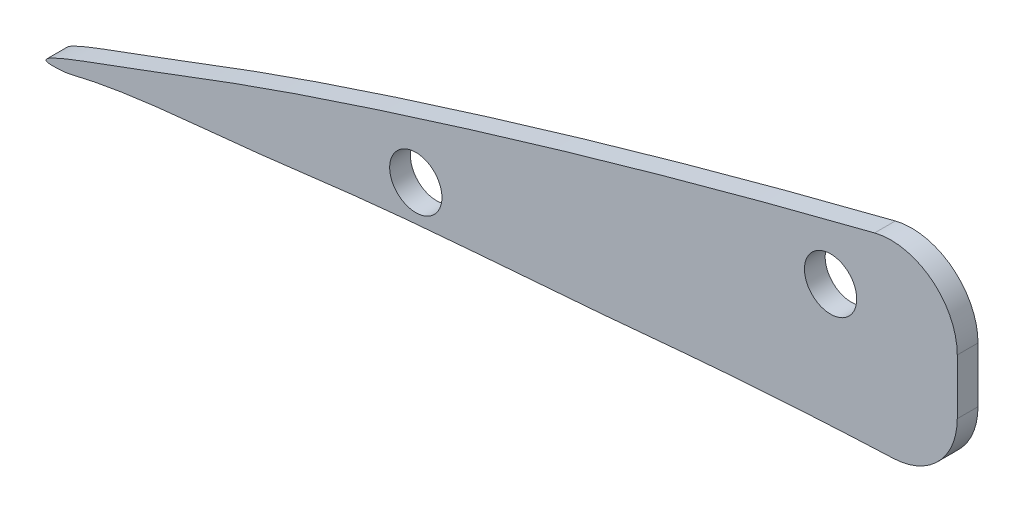
ISO-10303-21;
HEADER;
FILE_DESCRIPTION(('STEP AP214'),'2;1');
FILE_NAME('part.step','',(''),(''),'','','');
FILE_SCHEMA(('AUTOMOTIVE_DESIGN { 1 0 10303 214 1 1 1 1 }'));
ENDSEC;
DATA;
#1=APPLICATION_CONTEXT('core data for automotive mechanical design processes');
#2=APPLICATION_PROTOCOL_DEFINITION('international standard','automotive_design',2000,#1);
#3=PRODUCT_CONTEXT('',#1,'mechanical');
#4=PRODUCT('Part','Part','',(#3));
#5=PRODUCT_RELATED_PRODUCT_CATEGORY('part','',(#4));
#6=PRODUCT_DEFINITION_FORMATION('','',#4);
#7=PRODUCT_DEFINITION_CONTEXT('part definition',#1,'design');
#8=PRODUCT_DEFINITION('design','',#6,#7);
#9=PRODUCT_DEFINITION_SHAPE('','',#8);
#10=(LENGTH_UNIT() NAMED_UNIT(*) SI_UNIT(.MILLI.,.METRE.));
#11=(NAMED_UNIT(*) PLANE_ANGLE_UNIT() SI_UNIT($,.RADIAN.));
#12=(NAMED_UNIT(*) SI_UNIT($,.STERADIAN.) SOLID_ANGLE_UNIT());
#13=UNCERTAINTY_MEASURE_WITH_UNIT(LENGTH_MEASURE(1.E-05),#10,'distance_accuracy_value','');
#14=(GEOMETRIC_REPRESENTATION_CONTEXT(3) GLOBAL_UNCERTAINTY_ASSIGNED_CONTEXT((#13)) GLOBAL_UNIT_ASSIGNED_CONTEXT((#10,
#11,#12)) REPRESENTATION_CONTEXT('',''));
#15=CARTESIAN_POINT('',(0.,0.,0.));
#16=DIRECTION('',(0.,0.,1.));
#17=DIRECTION('',(1.,0.,0.));
#18=AXIS2_PLACEMENT_3D('',#15,#16,#17);
#19=CARTESIAN_POINT('',(99.3263908498514,18.4043947955345,226.06));
#20=CARTESIAN_POINT('',(77.8897663550013,13.4600133742419,226.06));
#21=CARTESIAN_POINT('',(52.9151511310183,7.64591830417928,226.06));
#22=CARTESIAN_POINT('',(19.7236271376638,-3.09277748737412,226.06));
#23=CARTESIAN_POINT('',(11.5033281919687,-6.35349465458856,226.06));
#24=CARTESIAN_POINT('',(1.30453703308477,-10.0425234793443,226.06));
#25=CARTESIAN_POINT('',(5.04760380641423,-9.65371338433422,226.06));
#26=B_SPLINE_CURVE_WITH_KNOTS('',3,(#19,#20,#21,#22,#23,#24,#25),.UNSPECIFIED.,.F.,.F.,(4,1,1,1,
4),(0.,0.630725310694853,0.824213609270468,0.940085476785923,1.),.UNSPECIFIED.);
#27=DIRECTION('',(0.,0.,-1.));
#28=VECTOR('',#27,1.);
#29=SURFACE_OF_LINEAR_EXTRUSION('',#26,#28);
#30=CARTESIAN_POINT('',(99.3263908498514,18.4043947955345,1.58750000000002));
#31=CARTESIAN_POINT('',(77.8897663550013,13.4600133742419,1.58750000000002));
#32=CARTESIAN_POINT('',(52.9151511310183,7.64591830417928,1.58750000000002));
#33=CARTESIAN_POINT('',(19.7236271376638,-3.09277748737412,1.58750000000002));
#34=CARTESIAN_POINT('',(11.5033281919687,-6.35349465458856,1.58750000000002));
#35=CARTESIAN_POINT('',(1.30453703308477,-10.0425234793443,1.58750000000002));
#36=CARTESIAN_POINT('',(5.04760380641423,-9.65371338433422,1.58750000000002));
#37=B_SPLINE_CURVE_WITH_KNOTS('',3,(#30,#31,#32,#33,#34,#35,#36),.UNSPECIFIED.,.F.,.F.,(4,1,1,1,
4),(0.,0.630725310694853,0.824213609270468,0.940085476785923,1.),.UNSPECIFIED.);
#38=CARTESIAN_POINT('',(66.8373423010903,10.6590815120083,1.58749999999999));
#39=VERTEX_POINT('',#38);
#40=CARTESIAN_POINT('',(5.04760380641423,-9.65371338433422,1.58750000000002));
#41=VERTEX_POINT('',#40);
#42=EDGE_CURVE('E84',#39,#41,#37,.T.);
#43=ORIENTED_EDGE('',*,*,#42,.F.);
#44=DIRECTION('',(0.,0.,-1.));
#45=VECTOR('',#44,1.);
#46=CARTESIAN_POINT('',(66.8373423010903,10.6590815120083,28.575));
#47=LINE('',#46,#45);
#48=CARTESIAN_POINT('',(66.8373423010903,10.6590815120083,0.));
#49=VERTEX_POINT('',#48);
#50=EDGE_CURVE('E47',#39,#49,#47,.T.);
#51=ORIENTED_EDGE('',*,*,#50,.T.);
#52=CARTESIAN_POINT('',(99.3263908498514,18.4043947955345,0.));
#53=CARTESIAN_POINT('',(77.8897663550013,13.4600133742419,0.));
#54=CARTESIAN_POINT('',(52.9151511310183,7.64591830417928,0.));
#55=CARTESIAN_POINT('',(19.7236271376638,-3.09277748737412,0.));
#56=CARTESIAN_POINT('',(11.5033281919687,-6.35349465458856,0.));
#57=CARTESIAN_POINT('',(1.30453703308477,-10.0425234793443,0.));
#58=CARTESIAN_POINT('',(5.04760380641423,-9.65371338433422,0.));
#59=B_SPLINE_CURVE_WITH_KNOTS('',3,(#52,#53,#54,#55,#56,#57,#58),.UNSPECIFIED.,.F.,.F.,(4,1,1,1,
4),(0.,0.630725310694853,0.824213609270468,0.940085476785923,1.),.UNSPECIFIED.);
#60=CARTESIAN_POINT('',(5.04760380641422,-9.65371338433422,0.));
#61=VERTEX_POINT('',#60);
#62=EDGE_CURVE('E133',#49,#61,#59,.T.);
#63=ORIENTED_EDGE('',*,*,#62,.T.);
#64=DIRECTION('',(0.,0.,-1.));
#65=VECTOR('',#64,1.);
#66=CARTESIAN_POINT('',(5.04760380641422,-9.65371338433422,226.06));
#67=LINE('',#66,#65);
#68=EDGE_CURVE('E90',#41,#61,#67,.T.);
#69=ORIENTED_EDGE('',*,*,#68,.F.);
#70=EDGE_LOOP('',(#43,#51,#63,#69));
#71=FACE_BOUND('',#70,.T.);
#72=ADVANCED_FACE('F38',(#71),#29,.F.);
#73=CARTESIAN_POINT('',(5.04760380641422,-9.65371338433422,226.06));
#74=CARTESIAN_POINT('',(9.48264965722818,-8.54612848277926,226.06));
#75=CARTESIAN_POINT('',(16.9884837285861,-8.07690609070966,226.06));
#76=CARTESIAN_POINT('',(30.336595099415,-6.25441019175279,226.06));
#77=CARTESIAN_POINT('',(41.9466597022993,-5.5660373440401,226.06));
#78=CARTESIAN_POINT('',(65.865842143348,-3.23134214309362,226.06));
#79=CARTESIAN_POINT('',(83.9748117251693,-3.08908655713665,226.06));
#80=CARTESIAN_POINT('',(99.3263908498514,-2.98644886203341,226.06));
#81=B_SPLINE_CURVE_WITH_KNOTS('',3,(#73,#74,#75,#76,#77,#78,#79,#80),.UNSPECIFIED.,.F.,.F.,(4,1,
1,1,1,4),(0.,0.144322392153104,0.23794765175378,0.427122749709389,0.512831912207282,1.),.UNSPECIFIED.);
#82=DIRECTION('',(0.,0.,-1.));
#83=VECTOR('',#82,1.);
#84=SURFACE_OF_LINEAR_EXTRUSION('',#81,#83);
#85=CARTESIAN_POINT('',(5.04760380641422,-9.65371338433422,1.58750000000007));
#86=CARTESIAN_POINT('',(9.48264965722818,-8.54612848277926,1.58750000000007));
#87=CARTESIAN_POINT('',(16.9884837285861,-8.07690609070966,1.58750000000007));
#88=CARTESIAN_POINT('',(30.336595099415,-6.25441019175279,1.58750000000007));
#89=CARTESIAN_POINT('',(41.9466597022993,-5.5660373440401,1.58750000000007));
#90=CARTESIAN_POINT('',(65.865842143348,-3.23134214309362,1.58750000000007));
#91=CARTESIAN_POINT('',(83.9748117251693,-3.08908655713665,1.58750000000007));
#92=CARTESIAN_POINT('',(99.3263908498514,-2.98644886203341,1.58750000000007));
#93=B_SPLINE_CURVE_WITH_KNOTS('',3,(#85,#86,#87,#88,#89,#90,#91,#92),.UNSPECIFIED.,.F.,.F.,(4,1,
1,1,1,4),(0.,0.144322392153104,0.23794765175378,0.427122749709389,0.512831912207282,1.),.UNSPECIFIED.);
#94=CARTESIAN_POINT('',(68.2984993183593,-3.56897292913028,1.5875));
#95=VERTEX_POINT('',#94);
#96=EDGE_CURVE('E141',#41,#95,#93,.T.);
#97=ORIENTED_EDGE('',*,*,#96,.F.);
#98=ORIENTED_EDGE('',*,*,#68,.T.);
#99=CARTESIAN_POINT('',(5.04760380641422,-9.65371338433422,0.));
#100=CARTESIAN_POINT('',(9.48264965722818,-8.54612848277926,0.));
#101=CARTESIAN_POINT('',(16.9884837285861,-8.07690609070966,0.));
#102=CARTESIAN_POINT('',(30.336595099415,-6.25441019175279,0.));
#103=CARTESIAN_POINT('',(41.9466597022993,-5.5660373440401,0.));
#104=CARTESIAN_POINT('',(65.865842143348,-3.23134214309362,0.));
#105=CARTESIAN_POINT('',(83.9748117251693,-3.08908655713665,0.));
#106=CARTESIAN_POINT('',(99.3263908498514,-2.98644886203341,0.));
#107=B_SPLINE_CURVE_WITH_KNOTS('',3,(#99,#100,#101,#102,#103,#104,#105,#106),.UNSPECIFIED.,.F.,
.F.,(4,1,1,1,1,4),(0.,0.144322392153104,0.23794765175378,0.427122749709389,0.512831912207282,
1.),.UNSPECIFIED.);
#108=CARTESIAN_POINT('',(68.2984993183593,-3.56897292913028,0.));
#109=VERTEX_POINT('',#108);
#110=EDGE_CURVE('E127',#61,#109,#107,.T.);
#111=ORIENTED_EDGE('',*,*,#110,.T.);
#112=DIRECTION('',(0.,0.,-1.));
#113=VECTOR('',#112,1.);
#114=CARTESIAN_POINT('',(68.2984993183594,-3.56897292913028,0.));
#115=LINE('',#114,#113);
#116=EDGE_CURVE('E117',#109,#95,#115,.F.);
#117=ORIENTED_EDGE('',*,*,#116,.T.);
#118=EDGE_LOOP('',(#97,#98,#111,#117));
#119=FACE_BOUND('',#118,.T.);
#120=ADVANCED_FACE('F40',(#119),#84,.F.);
#121=CARTESIAN_POINT('',(73.1643908498514,-9.84811843183929,28.575));
#122=DIRECTION('',(-1.,0.,0.));
#123=DIRECTION('',(0.,0.,1.));
#124=AXIS2_PLACEMENT_3D('',#121,#122,#123);
#125=PLANE('',#124);
#126=DIRECTION('',(0.,1.,0.));
#127=VECTOR('',#126,1.);
#128=CARTESIAN_POINT('',(73.1643908498514,-9.84811843183929,1.5875));
#129=LINE('',#128,#127);
#130=CARTESIAN_POINT('',(73.1643908498514,1.50651301447287,1.5875));
#131=VERTEX_POINT('',#130);
#132=CARTESIAN_POINT('',(73.1643908498514,5.73452367225935,1.5875));
#133=VERTEX_POINT('',#132);
#134=EDGE_CURVE('E54',#131,#133,#129,.T.);
#135=ORIENTED_EDGE('',*,*,#134,.F.);
#136=DIRECTION('',(0.,0.,-1.));
#137=VECTOR('',#136,1.);
#138=CARTESIAN_POINT('',(73.1643908498514,1.50651301447288,28.575));
#139=LINE('',#138,#137);
#140=CARTESIAN_POINT('',(73.1643908498514,1.50651301447287,0.));
#141=VERTEX_POINT('',#140);
#142=EDGE_CURVE('E111',#131,#141,#139,.T.);
#143=ORIENTED_EDGE('',*,*,#142,.T.);
#144=DIRECTION('',(0.,-1.,0.));
#145=VECTOR('',#144,1.);
#146=CARTESIAN_POINT('',(73.1643908498514,6.28192405171267,0.));
#147=LINE('',#146,#145);
#148=CARTESIAN_POINT('',(73.1643908498514,5.73452367225935,0.));
#149=VERTEX_POINT('',#148);
#150=EDGE_CURVE('E121',#149,#141,#147,.T.);
#151=ORIENTED_EDGE('',*,*,#150,.F.);
#152=DIRECTION('',(0.,0.,-1.));
#153=VECTOR('',#152,1.);
#154=CARTESIAN_POINT('',(73.1643908498514,5.73452367225935,28.575));
#155=LINE('',#154,#153);
#156=EDGE_CURVE('E114',#149,#133,#155,.F.);
#157=ORIENTED_EDGE('',*,*,#156,.T.);
#158=EDGE_LOOP('',(#135,#143,#151,#157));
#159=FACE_BOUND('',#158,.T.);
#160=ADVANCED_FACE('F163',(#159),#125,.F.);
#161=CARTESIAN_POINT('',(68.0843908498514,1.50651301447287,14.2875));
#162=DIRECTION('',(0.,0.,-1.));
#163=DIRECTION('',(-1.,0.,0.));
#164=AXIS2_PLACEMENT_3D('',#161,#162,#163);
#165=CYLINDRICAL_SURFACE('',#164,5.08);
#166=ORIENTED_EDGE('',*,*,#142,.F.);
#167=CARTESIAN_POINT('',(68.0843908498514,1.50651301447287,1.5875));
#168=DIRECTION('',(0.,0.,1.));
#169=DIRECTION('',(0.,-1.,0.));
#170=AXIS2_PLACEMENT_3D('',#167,#168,#169);
#171=CIRCLE('',#170,5.08);
#172=EDGE_CURVE('E92',#131,#95,#171,.F.);
#173=ORIENTED_EDGE('',*,*,#172,.T.);
#174=ORIENTED_EDGE('',*,*,#116,.F.);
#175=CARTESIAN_POINT('',(68.0843908498514,1.50651301447287,0.));
#176=DIRECTION('',(0.,0.,1.));
#177=DIRECTION('',(1.,0.,0.));
#178=AXIS2_PLACEMENT_3D('',#175,#176,#177);
#179=CIRCLE('',#178,5.08);
#180=EDGE_CURVE('E98',#141,#109,#179,.F.);
#181=ORIENTED_EDGE('',*,*,#180,.F.);
#182=EDGE_LOOP('',(#166,#173,#174,#181));
#183=FACE_BOUND('',#182,.T.);
#184=ADVANCED_FACE('F161',(#183),#165,.T.);
#185=CARTESIAN_POINT('',(68.0843908498514,5.73452367225935,14.2875000000001));
#186=DIRECTION('',(0.,0.,-1.));
#187=DIRECTION('',(-1.,0.,0.));
#188=AXIS2_PLACEMENT_3D('',#185,#186,#187);
#189=CYLINDRICAL_SURFACE('',#188,5.08);
#190=ORIENTED_EDGE('',*,*,#50,.F.);
#191=CARTESIAN_POINT('',(68.0843908498514,5.73452367225935,1.5875));
#192=DIRECTION('',(0.,0.,1.));
#193=DIRECTION('',(0.,-1.,0.));
#194=AXIS2_PLACEMENT_3D('',#191,#192,#193);
#195=CIRCLE('',#194,5.08);
#196=EDGE_CURVE('E11',#39,#133,#195,.F.);
#197=ORIENTED_EDGE('',*,*,#196,.T.);
#198=ORIENTED_EDGE('',*,*,#156,.F.);
#199=CARTESIAN_POINT('',(68.0843908498514,5.73452367225935,0.));
#200=DIRECTION('',(0.,0.,1.));
#201=DIRECTION('',(1.,0.,0.));
#202=AXIS2_PLACEMENT_3D('',#199,#200,#201);
#203=CIRCLE('',#202,5.08);
#204=EDGE_CURVE('E95',#49,#149,#203,.F.);
#205=ORIENTED_EDGE('',*,*,#204,.F.);
#206=EDGE_LOOP('',(#190,#197,#198,#205));
#207=FACE_BOUND('',#206,.T.);
#208=ADVANCED_FACE('F94',(#207),#189,.T.);
#209=CARTESIAN_POINT('',(50.3667951564081,6.28192405171267,0.));
#210=DIRECTION('',(0.,0.,1.));
#211=DIRECTION('',(1.,0.,0.));
#212=AXIS2_PLACEMENT_3D('',#209,#210,#211);
#213=PLANE('',#212);
#214=CARTESIAN_POINT('',(31.7176038064142,-3.55771338433423,0.));
#215=DIRECTION('',(0.,0.,1.));
#216=DIRECTION('',(1.,0.,0.));
#217=AXIS2_PLACEMENT_3D('',#214,#215,#216);
#218=CIRCLE('',#217,2.);
#219=CARTESIAN_POINT('',(33.7176038064142,-3.55771338433423,0.));
#220=VERTEX_POINT('',#219);
#221=EDGE_CURVE('E179',#220,#220,#218,.T.);
#222=ORIENTED_EDGE('',*,*,#221,.T.);
#223=EDGE_LOOP('',(#222));
#224=FACE_BOUND('',#223,.T.);
#225=CARTESIAN_POINT('',(63.4676038064142,5.58628661566577,0.));
#226=DIRECTION('',(0.,0.,1.));
#227=DIRECTION('',(1.,0.,0.));
#228=AXIS2_PLACEMENT_3D('',#225,#226,#227);
#229=CIRCLE('',#228,2.);
#230=CARTESIAN_POINT('',(65.4676038064142,5.58628661566577,0.));
#231=VERTEX_POINT('',#230);
#232=EDGE_CURVE('E183',#231,#231,#229,.T.);
#233=ORIENTED_EDGE('',*,*,#232,.T.);
#234=EDGE_LOOP('',(#233));
#235=FACE_BOUND('',#234,.T.);
#236=ORIENTED_EDGE('',*,*,#150,.T.);
#237=ORIENTED_EDGE('',*,*,#180,.T.);
#238=ORIENTED_EDGE('',*,*,#110,.F.);
#239=ORIENTED_EDGE('',*,*,#62,.F.);
#240=ORIENTED_EDGE('',*,*,#204,.T.);
#241=EDGE_LOOP('',(#236,#237,#238,#239,#240));
#242=FACE_BOUND('',#241,.T.);
#243=ADVANCED_FACE('F159',(#224,#235,#242),#213,.F.);
#244=CARTESIAN_POINT('',(3.1093353208263,-35.3865971957691,1.5875));
#245=DIRECTION('',(0.,0.,1.));
#246=DIRECTION('',(0.,-1.,0.));
#247=AXIS2_PLACEMENT_3D('',#244,#245,#246);
#248=PLANE('',#247);
#249=CARTESIAN_POINT('',(31.7176038064142,-3.55771338433423,1.5875));
#250=DIRECTION('',(0.,0.,1.));
#251=DIRECTION('',(1.,0.,0.));
#252=AXIS2_PLACEMENT_3D('',#249,#250,#251);
#253=CIRCLE('',#252,2.);
#254=CARTESIAN_POINT('',(33.7176038064142,-3.55771338433423,1.5875));
#255=VERTEX_POINT('',#254);
#256=EDGE_CURVE('E208',#255,#255,#253,.T.);
#257=ORIENTED_EDGE('',*,*,#256,.F.);
#258=EDGE_LOOP('',(#257));
#259=FACE_BOUND('',#258,.T.);
#260=CARTESIAN_POINT('',(63.4676038064142,5.58628661566577,1.5875));
#261=DIRECTION('',(0.,0.,1.));
#262=DIRECTION('',(1.,0.,0.));
#263=AXIS2_PLACEMENT_3D('',#260,#261,#262);
#264=CIRCLE('',#263,2.);
#265=CARTESIAN_POINT('',(65.4676038064142,5.58628661566577,1.5875));
#266=VERTEX_POINT('',#265);
#267=EDGE_CURVE('E202',#266,#266,#264,.T.);
#268=ORIENTED_EDGE('',*,*,#267,.F.);
#269=EDGE_LOOP('',(#268));
#270=FACE_BOUND('',#269,.T.);
#271=ORIENTED_EDGE('',*,*,#96,.T.);
#272=ORIENTED_EDGE('',*,*,#172,.F.);
#273=ORIENTED_EDGE('',*,*,#134,.T.);
#274=ORIENTED_EDGE('',*,*,#196,.F.);
#275=ORIENTED_EDGE('',*,*,#42,.T.);
#276=EDGE_LOOP('',(#271,#272,#273,#274,#275));
#277=FACE_BOUND('',#276,.T.);
#278=ADVANCED_FACE('F83',(#259,#270,#277),#248,.T.);
#279=CARTESIAN_POINT('',(63.4676038064142,5.58628661566577,0.));
#280=DIRECTION('',(0.,0.,1.));
#281=DIRECTION('',(1.,0.,0.));
#282=AXIS2_PLACEMENT_3D('',#279,#280,#281);
#283=CYLINDRICAL_SURFACE('',#282,2.);
#284=ORIENTED_EDGE('',*,*,#232,.F.);
#285=EDGE_LOOP('',(#284));
#286=FACE_BOUND('',#285,.T.);
#287=ORIENTED_EDGE('',*,*,#267,.T.);
#288=EDGE_LOOP('',(#287));
#289=FACE_BOUND('',#288,.T.);
#290=ADVANCED_FACE('F173',(#286,#289),#283,.F.);
#291=CARTESIAN_POINT('',(31.7176038064142,-3.55771338433423,0.));
#292=DIRECTION('',(0.,0.,1.));
#293=DIRECTION('',(1.,0.,0.));
#294=AXIS2_PLACEMENT_3D('',#291,#292,#293);
#295=CYLINDRICAL_SURFACE('',#294,2.);
#296=ORIENTED_EDGE('',*,*,#221,.F.);
#297=EDGE_LOOP('',(#296));
#298=FACE_BOUND('',#297,.T.);
#299=ORIENTED_EDGE('',*,*,#256,.T.);
#300=EDGE_LOOP('',(#299));
#301=FACE_BOUND('',#300,.T.);
#302=ADVANCED_FACE('F215',(#298,#301),#295,.F.);
#303=CLOSED_SHELL('',(#72,#120,#160,#184,#208,#243,#278,#290,#302));
#304=MANIFOLD_SOLID_BREP('B2',#303);
#305=ADVANCED_BREP_SHAPE_REPRESENTATION('',(#18,#304),#14);
#306=SHAPE_DEFINITION_REPRESENTATION(#9,#305);
ENDSEC;
END-ISO-10303-21;
